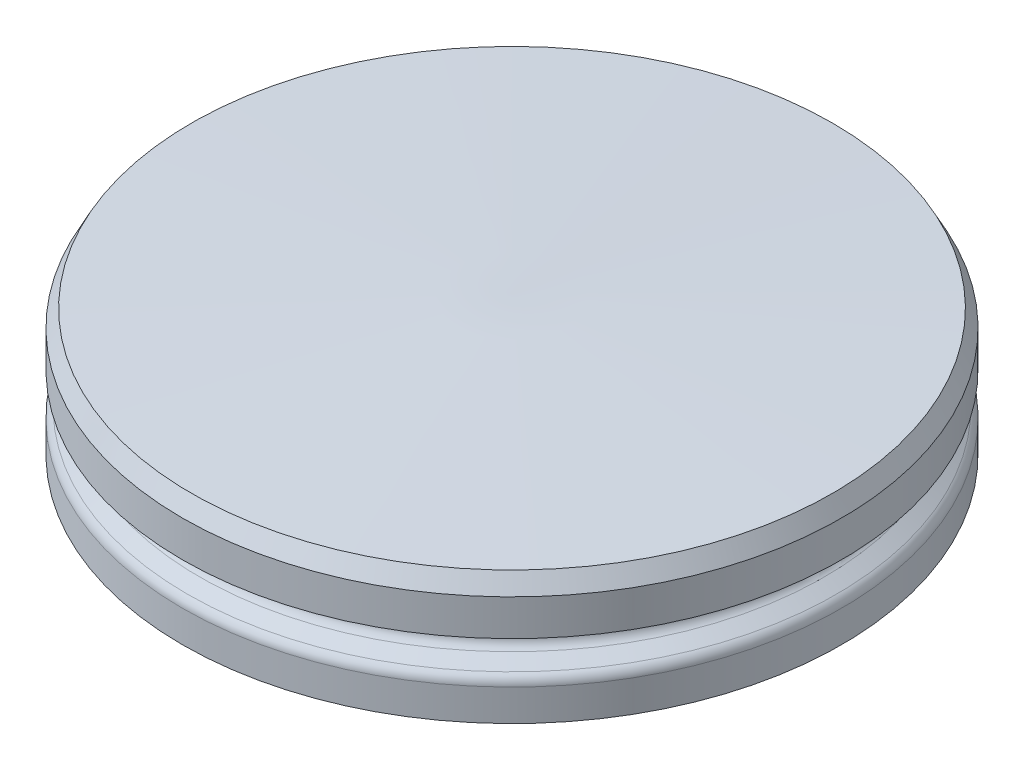
ISO-10303-21;
HEADER;
FILE_DESCRIPTION(('STEP AP214'),'2;1');
FILE_NAME('part.step','',(''),(''),'','','');
FILE_SCHEMA(('AUTOMOTIVE_DESIGN { 1 0 10303 214 1 1 1 1 }'));
ENDSEC;
DATA;
#1=APPLICATION_CONTEXT('core data for automotive mechanical design processes');
#2=APPLICATION_PROTOCOL_DEFINITION('international standard','automotive_design',2000,#1);
#3=PRODUCT_CONTEXT('',#1,'mechanical');
#4=PRODUCT('Part','Part','',(#3));
#5=PRODUCT_RELATED_PRODUCT_CATEGORY('part','',(#4));
#6=PRODUCT_DEFINITION_FORMATION('','',#4);
#7=PRODUCT_DEFINITION_CONTEXT('part definition',#1,'design');
#8=PRODUCT_DEFINITION('design','',#6,#7);
#9=PRODUCT_DEFINITION_SHAPE('','',#8);
#10=(LENGTH_UNIT() NAMED_UNIT(*) SI_UNIT(.MILLI.,.METRE.));
#11=(NAMED_UNIT(*) PLANE_ANGLE_UNIT() SI_UNIT($,.RADIAN.));
#12=(NAMED_UNIT(*) SI_UNIT($,.STERADIAN.) SOLID_ANGLE_UNIT());
#13=UNCERTAINTY_MEASURE_WITH_UNIT(LENGTH_MEASURE(1.E-05),#10,'distance_accuracy_value','');
#14=(GEOMETRIC_REPRESENTATION_CONTEXT(3) GLOBAL_UNCERTAINTY_ASSIGNED_CONTEXT((#13)) GLOBAL_UNIT_ASSIGNED_CONTEXT((#10,
#11,#12)) REPRESENTATION_CONTEXT('',''));
#15=CARTESIAN_POINT('',(0.,0.,0.));
#16=DIRECTION('',(0.,0.,1.));
#17=DIRECTION('',(1.,0.,0.));
#18=AXIS2_PLACEMENT_3D('',#15,#16,#17);
#19=CARTESIAN_POINT('',(0.,-2.77299376302073,0.));
#20=DIRECTION('',(0.,-1.,0.));
#21=DIRECTION('',(0.,0.,-1.));
#22=AXIS2_PLACEMENT_3D('',#19,#20,#21);
#23=CONICAL_SURFACE('',#22,70.2491753298586,1.53134312569786);
#24=CARTESIAN_POINT('',(0.,-2.69785491143148,0.));
#25=DIRECTION('',(0.,1.,0.));
#26=DIRECTION('',(0.,0.,1.));
#27=AXIS2_PLACEMENT_3D('',#24,#25,#26);
#28=CIRCLE('',#27,68.3456577562644);
#29=CARTESIAN_POINT('',(0.,-2.69785491143148,-68.3456577562644));
#30=VERTEX_POINT('',#29);
#31=EDGE_CURVE('E11',#30,#30,#28,.T.);
#32=ORIENTED_EDGE('',*,*,#31,.T.);
#33=EDGE_LOOP('',(#32));
#34=FACE_BOUND('',#33,.T.);
#35=CARTESIAN_POINT('',(0.,0.,0.));
#36=VERTEX_POINT('',#35);
#37=VERTEX_LOOP('',#36);
#38=FACE_BOUND('',#37,.T.);
#39=ADVANCED_FACE('F41',(#34,#38),#23,.T.);
#40=CARTESIAN_POINT('',(0.,-26.9359085791221,0.));
#41=DIRECTION('',(0.,-1.,0.));
#42=DIRECTION('',(0.,0.,-1.));
#43=AXIS2_PLACEMENT_3D('',#40,#41,#42);
#44=CYLINDRICAL_SURFACE('',#43,70.2491753298586);
#45=CARTESIAN_POINT('',(0.,-6.31745662705829,0.));
#46=DIRECTION('',(0.,1.,0.));
#47=DIRECTION('',(0.,0.,1.));
#48=AXIS2_PLACEMENT_3D('',#45,#46,#47);
#49=CIRCLE('',#48,70.2491753298586);
#50=CARTESIAN_POINT('',(0.,-6.31745662705829,-70.2491753298586));
#51=VERTEX_POINT('',#50);
#52=EDGE_CURVE('E50',#51,#51,#49,.F.);
#53=ORIENTED_EDGE('',*,*,#52,.T.);
#54=EDGE_LOOP('',(#53));
#55=FACE_BOUND('',#54,.T.);
#56=CARTESIAN_POINT('',(0.,-14.0292038837897,0.));
#57=DIRECTION('',(0.,-1.,0.));
#58=DIRECTION('',(0.,0.,-1.));
#59=AXIS2_PLACEMENT_3D('',#56,#57,#58);
#60=CIRCLE('',#59,70.2491753298586);
#61=CARTESIAN_POINT('',(0.,-14.0292038837897,-70.2491753298586));
#62=VERTEX_POINT('',#61);
#63=EDGE_CURVE('E104',#62,#62,#60,.T.);
#64=ORIENTED_EDGE('',*,*,#63,.F.);
#65=EDGE_LOOP('',(#64));
#66=FACE_BOUND('',#65,.T.);
#67=ADVANCED_FACE('F74',(#55,#66),#44,.T.);
#68=CARTESIAN_POINT('',(0.,-15.4733866365327,0.));
#69=DIRECTION('',(0.,1.,0.));
#70=DIRECTION('',(0.,0.,1.));
#71=AXIS2_PLACEMENT_3D('',#68,#69,#70);
#72=CONICAL_SURFACE('',#71,61.5840788134002,1.40564764938027);
#73=CARTESIAN_POINT('',(0.,-14.4652752039585,0.));
#74=DIRECTION('',(0.,1.,0.));
#75=DIRECTION('',(0.,0.,1.));
#76=AXIS2_PLACEMENT_3D('',#73,#74,#75);
#77=CIRCLE('',#76,67.6327474088455);
#78=CARTESIAN_POINT('',(0.,-14.4652752039585,67.6327474088455));
#79=VERTEX_POINT('',#78);
#80=EDGE_CURVE('E93',#79,#79,#77,.T.);
#81=ORIENTED_EDGE('',*,*,#80,.T.);
#82=EDGE_LOOP('',(#81));
#83=FACE_BOUND('',#82,.T.);
#84=ORIENTED_EDGE('',*,*,#63,.T.);
#85=EDGE_LOOP('',(#84));
#86=FACE_BOUND('',#85,.T.);
#87=ADVANCED_FACE('F80',(#83,#86),#72,.T.);
#88=CARTESIAN_POINT('',(0.,-21.6627412911458,0.));
#89=DIRECTION('',(0.,-1.,0.));
#90=DIRECTION('',(0.,0.,-1.));
#91=AXIS2_PLACEMENT_3D('',#88,#89,#90);
#92=CONICAL_SURFACE('',#91,70.2491753298586,0.950546840812077);
#93=CARTESIAN_POINT('',(0.,-20.9029877283219,0.));
#94=DIRECTION('',(0.,1.,0.));
#95=DIRECTION('',(0.,0.,1.));
#96=AXIS2_PLACEMENT_3D('',#93,#94,#95);
#97=CIRCLE('',#96,69.1855203419051);
#98=CARTESIAN_POINT('',(0.,-20.9029877283219,69.1855203419051));
#99=VERTEX_POINT('',#98);
#100=EDGE_CURVE('E98',#99,#99,#97,.T.);
#101=ORIENTED_EDGE('',*,*,#100,.T.);
#102=EDGE_LOOP('',(#101));
#103=FACE_BOUND('',#102,.T.);
#104=CARTESIAN_POINT('',(0.,-19.0375987873573,0.));
#105=DIRECTION('',(0.,-1.,0.));
#106=DIRECTION('',(0.,0.,-1.));
#107=AXIS2_PLACEMENT_3D('',#104,#105,#106);
#108=CIRCLE('',#107,66.5739758245546);
#109=CARTESIAN_POINT('',(0.,-19.0375987873573,-66.5739758245546));
#110=VERTEX_POINT('',#109);
#111=EDGE_CURVE('E96',#110,#110,#108,.T.);
#112=ORIENTED_EDGE('',*,*,#111,.T.);
#113=EDGE_LOOP('',(#112));
#114=FACE_BOUND('',#113,.T.);
#115=ADVANCED_FACE('F69',(#103,#114),#92,.T.);
#116=CARTESIAN_POINT('',(0.,-26.9359085791221,0.));
#117=DIRECTION('',(0.,-1.,0.));
#118=DIRECTION('',(0.,0.,-1.));
#119=AXIS2_PLACEMENT_3D('',#116,#117,#118);
#120=CYLINDRICAL_SURFACE('',#119,70.2491753298586);
#121=CARTESIAN_POINT('',(0.,-22.969870745187,0.));
#122=DIRECTION('',(0.,1.,0.));
#123=DIRECTION('',(0.,0.,1.));
#124=AXIS2_PLACEMENT_3D('',#121,#122,#123);
#125=CIRCLE('',#124,70.2491753298586);
#126=CARTESIAN_POINT('',(0.,-22.969870745187,70.2491753298586));
#127=VERTEX_POINT('',#126);
#128=EDGE_CURVE('E99',#127,#127,#125,.F.);
#129=ORIENTED_EDGE('',*,*,#128,.T.);
#130=EDGE_LOOP('',(#129));
#131=FACE_BOUND('',#130,.T.);
#132=CARTESIAN_POINT('',(0.,-29.7089023421428,0.));
#133=DIRECTION('',(0.,-1.,0.));
#134=DIRECTION('',(0.,0.,-1.));
#135=AXIS2_PLACEMENT_3D('',#132,#133,#134);
#136=CIRCLE('',#135,70.2491753298586);
#137=CARTESIAN_POINT('',(0.,-29.7089023421428,-70.2491753298586));
#138=VERTEX_POINT('',#137);
#139=EDGE_CURVE('E115',#138,#138,#136,.T.);
#140=ORIENTED_EDGE('',*,*,#139,.F.);
#141=EDGE_LOOP('',(#140));
#142=FACE_BOUND('',#141,.T.);
#143=ADVANCED_FACE('F59',(#131,#142),#120,.T.);
#144=CARTESIAN_POINT('',(0.,-26.9359085791221,0.));
#145=DIRECTION('',(0.,-1.,0.));
#146=DIRECTION('',(0.,0.,-1.));
#147=AXIS2_PLACEMENT_3D('',#144,#145,#146);
#148=CONICAL_SURFACE('',#147,0.,1.53134312569786);
#149=ORIENTED_EDGE('',*,*,#139,.T.);
#150=EDGE_LOOP('',(#149));
#151=FACE_BOUND('',#150,.T.);
#152=CARTESIAN_POINT('',(0.,-26.9359085791221,0.));
#153=VERTEX_POINT('',#152);
#154=VERTEX_LOOP('',#153);
#155=FACE_BOUND('',#154,.T.);
#156=ADVANCED_FACE('F56',(#151,#155),#148,.F.);
#157=CARTESIAN_POINT('',(0.,-22.969870745187,0.));
#158=DIRECTION('',(0.,1.,0.));
#159=DIRECTION('',(0.,0.,1.));
#160=AXIS2_PLACEMENT_3D('',#157,#158,#159);
#161=TOROIDAL_SURFACE('',#160,67.7091753298586,2.54);
#162=ORIENTED_EDGE('',*,*,#100,.F.);
#163=EDGE_LOOP('',(#162));
#164=FACE_BOUND('',#163,.T.);
#165=ORIENTED_EDGE('',*,*,#128,.F.);
#166=EDGE_LOOP('',(#165));
#167=FACE_BOUND('',#166,.T.);
#168=ADVANCED_FACE('F58',(#164,#167),#161,.T.);
#169=CARTESIAN_POINT('',(0.,-16.9707157704922,0.));
#170=DIRECTION('',(0.,-1.,0.));
#171=DIRECTION('',(0.,0.,-1.));
#172=AXIS2_PLACEMENT_3D('',#169,#170,#171);
#173=TOROIDAL_SURFACE('',#172,68.0503208366011,2.54);
#174=ORIENTED_EDGE('',*,*,#80,.F.);
#175=EDGE_LOOP('',(#174));
#176=FACE_BOUND('',#175,.T.);
#177=ORIENTED_EDGE('',*,*,#111,.F.);
#178=EDGE_LOOP('',(#177));
#179=FACE_BOUND('',#178,.T.);
#180=ADVANCED_FACE('F66',(#176,#179),#173,.F.);
#181=CARTESIAN_POINT('',(0.,-6.31745662705829,0.));
#182=DIRECTION('',(0.,-1.,0.));
#183=DIRECTION('',(0.,0.,-1.));
#184=AXIS2_PLACEMENT_3D('',#181,#182,#183);
#185=CONICAL_SURFACE('',#184,70.2491753298586,0.484145574501261);
#186=CARTESIAN_POINT('',(0.,-2.69785491143148,-68.3456577562644));
#187=CARTESIAN_POINT('',(0.,-2.73555909596926,-68.3654860643227));
#188=CARTESIAN_POINT('',(0.,-2.77326328050704,-68.3853143723809));
#189=CARTESIAN_POINT('',(0.,-2.8486716495826,-68.4249709884975));
#190=CARTESIAN_POINT('',(0.,-2.88637583412038,-68.4447992965558));
#191=CARTESIAN_POINT('',(0.,-2.96178420319594,-68.4844559126723));
#192=CARTESIAN_POINT('',(0.,-2.99948838773372,-68.5042842207306));
#193=CARTESIAN_POINT('',(0.,-3.07489675680927,-68.5439408368471));
#194=CARTESIAN_POINT('',(0.,-3.11260094134705,-68.5637691449054));
#195=CARTESIAN_POINT('',(0.,-3.18800931042261,-68.6034257610219));
#196=CARTESIAN_POINT('',(0.,-3.22571349496039,-68.6232540690802));
#197=CARTESIAN_POINT('',(0.,-3.30112186403595,-68.6629106851967));
#198=CARTESIAN_POINT('',(0.,-3.33882604857373,-68.682738993255));
#199=CARTESIAN_POINT('',(0.,-3.41423441764929,-68.7223956093716));
#200=CARTESIAN_POINT('',(0.,-3.45193860218707,-68.7422239174298));
#201=CARTESIAN_POINT('',(0.,-3.52734697126262,-68.7818805335464));
#202=CARTESIAN_POINT('',(0.,-3.5650511558004,-68.8017088416047));
#203=CARTESIAN_POINT('',(0.,-3.64045952487596,-68.8413654577212));
#204=CARTESIAN_POINT('',(0.,-3.67816370941374,-68.8611937657795));
#205=CARTESIAN_POINT('',(0.,-3.7535720784893,-68.900850381896));
#206=CARTESIAN_POINT('',(0.,-3.79127626302708,-68.9206786899543));
#207=CARTESIAN_POINT('',(0.,-3.86668463210264,-68.9603353060708));
#208=CARTESIAN_POINT('',(0.,-3.90438881664042,-68.9801636141291));
#209=CARTESIAN_POINT('',(0.,-3.97979718571598,-69.0198202302457));
#210=CARTESIAN_POINT('',(0.,-4.01750137025375,-69.0396485383039));
#211=CARTESIAN_POINT('',(0.,-4.09290973932931,-69.0793051544205));
#212=CARTESIAN_POINT('',(0.,-4.13061392386709,-69.0991334624788));
#213=CARTESIAN_POINT('',(0.,-4.20602229294265,-69.1387900785953));
#214=CARTESIAN_POINT('',(0.,-4.24372647748043,-69.1586183866536));
#215=CARTESIAN_POINT('',(0.,-4.31913484655599,-69.1982750027701));
#216=CARTESIAN_POINT('',(0.,-4.35683903109377,-69.2181033108284));
#217=CARTESIAN_POINT('',(0.,-4.43224740016933,-69.2577599269449));
#218=CARTESIAN_POINT('',(0.,-4.4699515847071,-69.2775882350032));
#219=CARTESIAN_POINT('',(0.,-4.54535995378266,-69.3172448511198));
#220=CARTESIAN_POINT('',(0.,-4.58306413832044,-69.337073159178));
#221=CARTESIAN_POINT('',(0.,-4.658472507396,-69.3767297752946));
#222=CARTESIAN_POINT('',(0.,-4.69617669193378,-69.3965580833528));
#223=CARTESIAN_POINT('',(0.,-4.77158506100934,-69.4362146994694));
#224=CARTESIAN_POINT('',(0.,-4.80928924554712,-69.4560430075277));
#225=CARTESIAN_POINT('',(0.,-4.88469761462268,-69.4956996236442));
#226=CARTESIAN_POINT('',(0.,-4.92240179916046,-69.5155279317025));
#227=CARTESIAN_POINT('',(0.,-4.99781016823601,-69.555184547819));
#228=CARTESIAN_POINT('',(0.,-5.03551435277379,-69.5750128558773));
#229=CARTESIAN_POINT('',(0.,-5.11092272184935,-69.6146694719938));
#230=CARTESIAN_POINT('',(0.,-5.14862690638713,-69.6344977800521));
#231=CARTESIAN_POINT('',(0.,-5.22403527546269,-69.6741543961687));
#232=CARTESIAN_POINT('',(0.,-5.26173946000047,-69.6939827042269));
#233=CARTESIAN_POINT('',(0.,-5.33714782907603,-69.7336393203435));
#234=CARTESIAN_POINT('',(0.,-5.37485201361381,-69.7534676284018));
#235=CARTESIAN_POINT('',(0.,-5.45026038268937,-69.7931242445183));
#236=CARTESIAN_POINT('',(0.,-5.48796456722714,-69.8129525525766));
#237=CARTESIAN_POINT('',(0.,-5.5633729363027,-69.8526091686931));
#238=CARTESIAN_POINT('',(0.,-5.60107712084048,-69.8724374767514));
#239=CARTESIAN_POINT('',(0.,-5.67648548991604,-69.9120940928679));
#240=CARTESIAN_POINT('',(0.,-5.71418967445382,-69.9319224009262));
#241=CARTESIAN_POINT('',(0.,-5.78959804352938,-69.9715790170428));
#242=CARTESIAN_POINT('',(0.,-5.82730222806716,-69.991407325101));
#243=CARTESIAN_POINT('',(0.,-5.90271059714272,-70.0310639412176));
#244=CARTESIAN_POINT('',(0.,-5.94041478168049,-70.0508922492758));
#245=CARTESIAN_POINT('',(0.,-6.01582315075605,-70.0905488653924));
#246=CARTESIAN_POINT('',(0.,-6.05352733529383,-70.1103771734507));
#247=CARTESIAN_POINT('',(0.,-6.12893570436939,-70.1500337895672));
#248=CARTESIAN_POINT('',(0.,-6.16663988890717,-70.1698620976255));
#249=CARTESIAN_POINT('',(0.,-6.24204825798273,-70.209518713742));
#250=CARTESIAN_POINT('',(0.,-6.27975244252051,-70.2293470218003));
#251=CARTESIAN_POINT('',(0.,-6.31745662705829,-70.2491753298586));
#252=B_SPLINE_CURVE_WITH_KNOTS('',3,(#186,#187,#188,#189,#190,#191,#192,#193,#194,#195,#196,
#197,#198,#199,#200,#201,#202,#203,#204,#205,#206,#207,#208,#209,#210,#211,#212,#213,#214,#215,
#216,#217,#218,#219,#220,#221,#222,#223,#224,#225,#226,#227,#228,#229,#230,#231,#232,#233,#234,
#235,#236,#237,#238,#239,#240,#241,#242,#243,#244,#245,#246,#247,#248,#249,#250,#251),
.UNSPECIFIED.,.F.,.F.,(4,2,2,2,2,2,2,2,2,2,2,2,2,2,2,2,2,2,2,2,2,2,2,2,2,2,2,2,2,2,2,2,4),(0.,
0.127800258172721,0.255600516345442,0.383400774518162,0.511201032690883,0.639001290863604,
0.766801549036325,0.894601807209046,1.02240206538177,1.15020232355449,1.27800258172721,
1.40580283989993,1.53360309807265,1.66140335624537,1.78920361441809,1.91700387259081,
2.04480413076353,2.17260438893625,2.30040464710898,2.4282049052817,2.55600516345442,
2.68380542162714,2.81160567979986,2.93940593797258,3.0672061961453,3.19500645431802,
3.32280671249074,3.45060697066346,3.57840722883618,3.70620748700891,3.83400774518163,
3.96180800335435,4.08960826152707),.UNSPECIFIED.);
#253=EDGE_CURVE('BSEAM44',#30,#51,#252,.T.);
#254=ORIENTED_EDGE('',*,*,#31,.F.);
#255=ORIENTED_EDGE('',*,*,#52,.F.);
#256=ORIENTED_EDGE('',*,*,#253,.T.);
#257=ORIENTED_EDGE('',*,*,#253,.F.);
#258=EDGE_LOOP('',(#254,#256,#255,#257));
#259=FACE_BOUND('',#258,.T.);
#260=ADVANCED_FACE('F44',(#259),#185,.T.);
#261=CLOSED_SHELL('',(#39,#67,#87,#115,#143,#156,#168,#180,#260));
#262=MANIFOLD_SOLID_BREP('B2',#261);
#263=ADVANCED_BREP_SHAPE_REPRESENTATION('',(#18,#262),#14);
#264=SHAPE_DEFINITION_REPRESENTATION(#9,#263);
ENDSEC;
END-ISO-10303-21;
